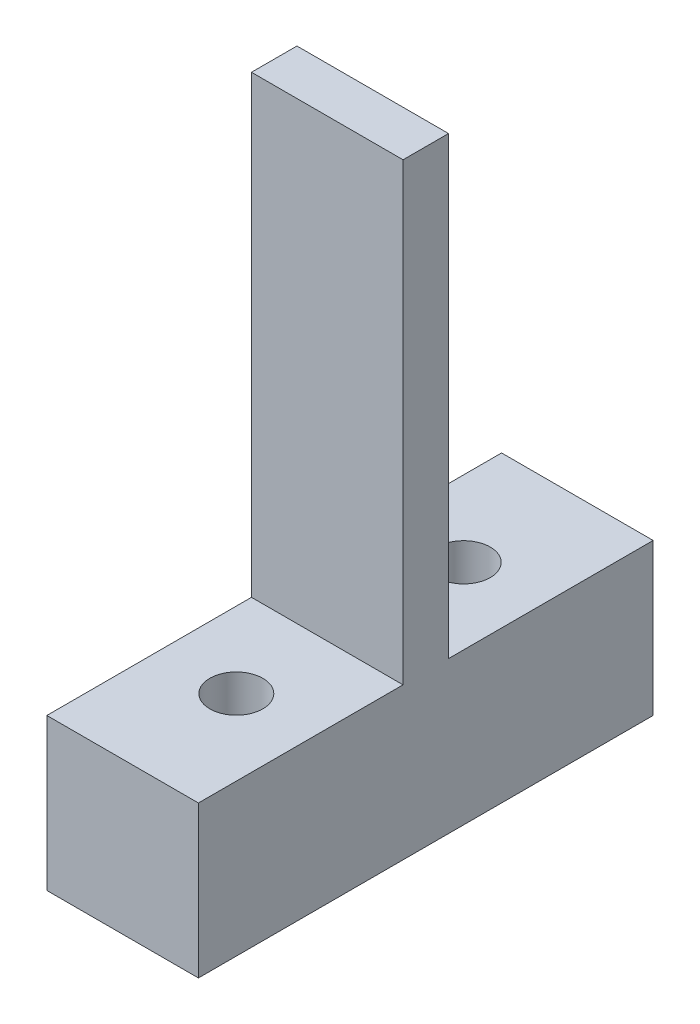
ISO-10303-21;
HEADER;
FILE_DESCRIPTION(('STEP AP214'),'2;1');
FILE_NAME('part.step','',(''),(''),'','','');
FILE_SCHEMA(('AUTOMOTIVE_DESIGN { 1 0 10303 214 1 1 1 1 }'));
ENDSEC;
DATA;
#1=APPLICATION_CONTEXT('core data for automotive mechanical design processes');
#2=APPLICATION_PROTOCOL_DEFINITION('international standard','automotive_design',2000,#1);
#3=PRODUCT_CONTEXT('',#1,'mechanical');
#4=PRODUCT('Part','Part','',(#3));
#5=PRODUCT_RELATED_PRODUCT_CATEGORY('part','',(#4));
#6=PRODUCT_DEFINITION_FORMATION('','',#4);
#7=PRODUCT_DEFINITION_CONTEXT('part definition',#1,'design');
#8=PRODUCT_DEFINITION('design','',#6,#7);
#9=PRODUCT_DEFINITION_SHAPE('','',#8);
#10=(LENGTH_UNIT() NAMED_UNIT(*) SI_UNIT(.MILLI.,.METRE.));
#11=(NAMED_UNIT(*) PLANE_ANGLE_UNIT() SI_UNIT($,.RADIAN.));
#12=(NAMED_UNIT(*) SI_UNIT($,.STERADIAN.) SOLID_ANGLE_UNIT());
#13=UNCERTAINTY_MEASURE_WITH_UNIT(LENGTH_MEASURE(1.E-05),#10,'distance_accuracy_value','');
#14=(GEOMETRIC_REPRESENTATION_CONTEXT(3) GLOBAL_UNCERTAINTY_ASSIGNED_CONTEXT((#13)) GLOBAL_UNIT_ASSIGNED_CONTEXT((#10,
#11,#12)) REPRESENTATION_CONTEXT('',''));
#15=CARTESIAN_POINT('',(0.,0.,0.));
#16=DIRECTION('',(0.,0.,1.));
#17=DIRECTION('',(1.,0.,0.));
#18=AXIS2_PLACEMENT_3D('',#15,#16,#17);
#19=CARTESIAN_POINT('',(0.,10.,0.));
#20=DIRECTION('',(0.,-1.,0.));
#21=DIRECTION('',(0.,0.,-1.));
#22=AXIS2_PLACEMENT_3D('',#19,#20,#21);
#23=PLANE('',#22);
#24=CARTESIAN_POINT('',(-41.8760329709807,10.,-13.3744966768709));
#25=DIRECTION('',(0.,1.,0.));
#26=DIRECTION('',(0.,0.,1.));
#27=AXIS2_PLACEMENT_3D('',#24,#25,#26);
#28=CIRCLE('',#27,1.75);
#29=CARTESIAN_POINT('',(-41.8760329709807,10.,-11.6244966768709));
#30=VERTEX_POINT('',#29);
#31=EDGE_CURVE('E125',#30,#30,#28,.T.);
#32=ORIENTED_EDGE('',*,*,#31,.F.);
#33=EDGE_LOOP('',(#32));
#34=FACE_BOUND('',#33,.T.);
#35=DIRECTION('',(-1.,0.,0.));
#36=VECTOR('',#35,1.);
#37=CARTESIAN_POINT('',(0.,10.,-7.37449667687092));
#38=LINE('',#37,#36);
#39=CARTESIAN_POINT('',(-36.8760329709807,10.,-7.37449667687092));
#40=VERTEX_POINT('',#39);
#41=CARTESIAN_POINT('',(-46.8760329709807,10.,-7.37449667687092));
#42=VERTEX_POINT('',#41);
#43=EDGE_CURVE('E49',#40,#42,#38,.T.);
#44=ORIENTED_EDGE('',*,*,#43,.F.);
#45=DIRECTION('',(0.,0.,-1.));
#46=VECTOR('',#45,1.);
#47=CARTESIAN_POINT('',(-36.8760329709807,10.,-20.8744966768709));
#48=LINE('',#47,#46);
#49=CARTESIAN_POINT('',(-36.8760329709807,10.,-20.8744966768709));
#50=VERTEX_POINT('',#49);
#51=EDGE_CURVE('E144',#40,#50,#48,.T.);
#52=ORIENTED_EDGE('',*,*,#51,.T.);
#53=DIRECTION('',(-1.,0.,0.));
#54=VECTOR('',#53,1.);
#55=CARTESIAN_POINT('',(-46.8760329709807,10.,-20.8744966768709));
#56=LINE('',#55,#54);
#57=CARTESIAN_POINT('',(-46.8760329709807,10.,-20.8744966768709));
#58=VERTEX_POINT('',#57);
#59=EDGE_CURVE('E147',#50,#58,#56,.T.);
#60=ORIENTED_EDGE('',*,*,#59,.T.);
#61=DIRECTION('',(0.,0.,1.));
#62=VECTOR('',#61,1.);
#63=CARTESIAN_POINT('',(-46.8760329709807,10.,9.12550332312908));
#64=LINE('',#63,#62);
#65=EDGE_CURVE('E140',#58,#42,#64,.T.);
#66=ORIENTED_EDGE('',*,*,#65,.T.);
#67=EDGE_LOOP('',(#44,#52,#60,#66));
#68=FACE_BOUND('',#67,.T.);
#69=ADVANCED_FACE('F34',(#34,#68),#23,.F.);
#70=CARTESIAN_POINT('',(-41.8760329709807,10.,1.62550332312908));
#71=DIRECTION('',(0.,1.,0.));
#72=DIRECTION('',(0.,0.,1.));
#73=AXIS2_PLACEMENT_3D('',#70,#71,#72);
#74=CIRCLE('',#73,1.75);
#75=CARTESIAN_POINT('',(-41.8760329709807,10.,3.37550332312908));
#76=VERTEX_POINT('',#75);
#77=EDGE_CURVE('E134',#76,#76,#74,.T.);
#78=ORIENTED_EDGE('',*,*,#77,.F.);
#79=EDGE_LOOP('',(#78));
#80=FACE_BOUND('',#79,.T.);
#81=DIRECTION('',(1.,0.,0.));
#82=VECTOR('',#81,1.);
#83=CARTESIAN_POINT('',(0.,10.,-4.37449667687092));
#84=LINE('',#83,#82);
#85=CARTESIAN_POINT('',(-46.8760329709807,10.,-4.37449667687092));
#86=VERTEX_POINT('',#85);
#87=CARTESIAN_POINT('',(-36.8760329709807,10.,-4.37449667687092));
#88=VERTEX_POINT('',#87);
#89=EDGE_CURVE('E57',#86,#88,#84,.T.);
#90=ORIENTED_EDGE('',*,*,#89,.F.);
#91=CARTESIAN_POINT('',(-46.8760329709807,10.,9.12550332312908));
#92=VERTEX_POINT('',#91);
#93=EDGE_CURVE('E121',#86,#92,#64,.T.);
#94=ORIENTED_EDGE('',*,*,#93,.T.);
#95=DIRECTION('',(1.,0.,0.));
#96=VECTOR('',#95,1.);
#97=CARTESIAN_POINT('',(-36.8760329709807,10.,9.12550332312908));
#98=LINE('',#97,#96);
#99=CARTESIAN_POINT('',(-36.8760329709807,10.,9.12550332312908));
#100=VERTEX_POINT('',#99);
#101=EDGE_CURVE('E142',#92,#100,#98,.T.);
#102=ORIENTED_EDGE('',*,*,#101,.T.);
#103=EDGE_CURVE('E145',#100,#88,#48,.T.);
#104=ORIENTED_EDGE('',*,*,#103,.T.);
#105=EDGE_LOOP('',(#90,#94,#102,#104));
#106=FACE_BOUND('',#105,.T.);
#107=ADVANCED_FACE('F200',(#80,#106),#23,.F.);
#108=CARTESIAN_POINT('',(0.,0.,0.));
#109=DIRECTION('',(0.,-1.,0.));
#110=DIRECTION('',(0.,0.,-1.));
#111=AXIS2_PLACEMENT_3D('',#108,#109,#110);
#112=PLANE('',#111);
#113=CARTESIAN_POINT('',(-41.8760329709807,0.,1.62550332312908));
#114=DIRECTION('',(0.,1.,0.));
#115=DIRECTION('',(0.,0.,1.));
#116=AXIS2_PLACEMENT_3D('',#113,#114,#115);
#117=CIRCLE('',#116,1.75);
#118=CARTESIAN_POINT('',(-41.8760329709807,0.,3.37550332312908));
#119=VERTEX_POINT('',#118);
#120=EDGE_CURVE('E132',#119,#119,#117,.T.);
#121=ORIENTED_EDGE('',*,*,#120,.T.);
#122=EDGE_LOOP('',(#121));
#123=FACE_BOUND('',#122,.T.);
#124=DIRECTION('',(0.,0.,1.));
#125=VECTOR('',#124,1.);
#126=CARTESIAN_POINT('',(-46.8760329709807,0.,9.12550332312908));
#127=LINE('',#126,#125);
#128=CARTESIAN_POINT('',(-46.8760329709807,0.,-20.8744966768709));
#129=VERTEX_POINT('',#128);
#130=CARTESIAN_POINT('',(-46.8760329709807,0.,9.12550332312908));
#131=VERTEX_POINT('',#130);
#132=EDGE_CURVE('E137',#129,#131,#127,.T.);
#133=ORIENTED_EDGE('',*,*,#132,.F.);
#134=DIRECTION('',(-1.,0.,0.));
#135=VECTOR('',#134,1.);
#136=CARTESIAN_POINT('',(-46.8760329709807,0.,-20.8744966768709));
#137=LINE('',#136,#135);
#138=CARTESIAN_POINT('',(-36.8760329709807,0.,-20.8744966768709));
#139=VERTEX_POINT('',#138);
#140=EDGE_CURVE('E155',#139,#129,#137,.T.);
#141=ORIENTED_EDGE('',*,*,#140,.F.);
#142=DIRECTION('',(0.,0.,-1.));
#143=VECTOR('',#142,1.);
#144=CARTESIAN_POINT('',(-36.8760329709807,0.,-20.8744966768709));
#145=LINE('',#144,#143);
#146=CARTESIAN_POINT('',(-36.8760329709807,0.,9.12550332312908));
#147=VERTEX_POINT('',#146);
#148=EDGE_CURVE('E153',#147,#139,#145,.T.);
#149=ORIENTED_EDGE('',*,*,#148,.F.);
#150=DIRECTION('',(1.,0.,0.));
#151=VECTOR('',#150,1.);
#152=CARTESIAN_POINT('',(-36.8760329709807,0.,9.12550332312908));
#153=LINE('',#152,#151);
#154=EDGE_CURVE('E151',#131,#147,#153,.T.);
#155=ORIENTED_EDGE('',*,*,#154,.F.);
#156=EDGE_LOOP('',(#133,#141,#149,#155));
#157=FACE_BOUND('',#156,.T.);
#158=CARTESIAN_POINT('',(-41.8760329709807,0.,-13.3744966768709));
#159=DIRECTION('',(0.,1.,0.));
#160=DIRECTION('',(0.,0.,1.));
#161=AXIS2_PLACEMENT_3D('',#158,#159,#160);
#162=CIRCLE('',#161,1.75);
#163=CARTESIAN_POINT('',(-41.8760329709807,0.,-11.6244966768709));
#164=VERTEX_POINT('',#163);
#165=EDGE_CURVE('E122',#164,#164,#162,.T.);
#166=ORIENTED_EDGE('',*,*,#165,.T.);
#167=EDGE_LOOP('',(#166));
#168=FACE_BOUND('',#167,.T.);
#169=ADVANCED_FACE('F173',(#123,#157,#168),#112,.T.);
#170=CARTESIAN_POINT('',(-46.8760329709807,10.,9.12550332312908));
#171=DIRECTION('',(1.,0.,0.));
#172=DIRECTION('',(0.,0.,-1.));
#173=AXIS2_PLACEMENT_3D('',#170,#171,#172);
#174=PLANE('',#173);
#175=ORIENTED_EDGE('',*,*,#132,.T.);
#176=DIRECTION('',(0.,-1.,0.));
#177=VECTOR('',#176,1.);
#178=CARTESIAN_POINT('',(-46.8760329709807,10.,9.12550332312908));
#179=LINE('',#178,#177);
#180=EDGE_CURVE('E11',#92,#131,#179,.T.);
#181=ORIENTED_EDGE('',*,*,#180,.F.);
#182=ORIENTED_EDGE('',*,*,#93,.F.);
#183=DIRECTION('',(0.,-1.,0.));
#184=VECTOR('',#183,1.);
#185=CARTESIAN_POINT('',(-46.8760329709807,40.,-4.37449667687092));
#186=LINE('',#185,#184);
#187=CARTESIAN_POINT('',(-46.8760329709807,40.,-4.37449667687092));
#188=VERTEX_POINT('',#187);
#189=EDGE_CURVE('E103',#188,#86,#186,.T.);
#190=ORIENTED_EDGE('',*,*,#189,.F.);
#191=DIRECTION('',(0.,0.,1.));
#192=VECTOR('',#191,1.);
#193=CARTESIAN_POINT('',(-46.8760329709807,40.,0.));
#194=LINE('',#193,#192);
#195=CARTESIAN_POINT('',(-46.8760329709807,40.,-7.37449667687092));
#196=VERTEX_POINT('',#195);
#197=EDGE_CURVE('E109',#196,#188,#194,.T.);
#198=ORIENTED_EDGE('',*,*,#197,.F.);
#199=DIRECTION('',(0.,-1.,0.));
#200=VECTOR('',#199,1.);
#201=CARTESIAN_POINT('',(-46.8760329709807,40.,-7.37449667687092));
#202=LINE('',#201,#200);
#203=EDGE_CURVE('E180',#196,#42,#202,.T.);
#204=ORIENTED_EDGE('',*,*,#203,.T.);
#205=ORIENTED_EDGE('',*,*,#65,.F.);
#206=DIRECTION('',(0.,-1.,0.));
#207=VECTOR('',#206,1.);
#208=CARTESIAN_POINT('',(-46.8760329709807,10.,-20.8744966768709));
#209=LINE('',#208,#207);
#210=EDGE_CURVE('E149',#58,#129,#209,.T.);
#211=ORIENTED_EDGE('',*,*,#210,.T.);
#212=EDGE_LOOP('',(#175,#181,#182,#190,#198,#204,#205,#211));
#213=FACE_BOUND('',#212,.T.);
#214=ADVANCED_FACE('F36',(#213),#174,.F.);
#215=CARTESIAN_POINT('',(-36.8760329709807,10.,9.12550332312908));
#216=DIRECTION('',(0.,0.,-1.));
#217=DIRECTION('',(-1.,0.,0.));
#218=AXIS2_PLACEMENT_3D('',#215,#216,#217);
#219=PLANE('',#218);
#220=ORIENTED_EDGE('',*,*,#154,.T.);
#221=DIRECTION('',(0.,-1.,0.));
#222=VECTOR('',#221,1.);
#223=CARTESIAN_POINT('',(-36.8760329709807,10.,9.12550332312908));
#224=LINE('',#223,#222);
#225=EDGE_CURVE('E42',#100,#147,#224,.T.);
#226=ORIENTED_EDGE('',*,*,#225,.F.);
#227=ORIENTED_EDGE('',*,*,#101,.F.);
#228=ORIENTED_EDGE('',*,*,#180,.T.);
#229=EDGE_LOOP('',(#220,#226,#227,#228));
#230=FACE_BOUND('',#229,.T.);
#231=ADVANCED_FACE('F218',(#230),#219,.F.);
#232=CARTESIAN_POINT('',(-36.8760329709807,10.,-20.8744966768709));
#233=DIRECTION('',(-1.,0.,0.));
#234=DIRECTION('',(0.,0.,1.));
#235=AXIS2_PLACEMENT_3D('',#232,#233,#234);
#236=PLANE('',#235);
#237=ORIENTED_EDGE('',*,*,#148,.T.);
#238=DIRECTION('',(0.,-1.,0.));
#239=VECTOR('',#238,1.);
#240=CARTESIAN_POINT('',(-36.8760329709807,10.,-20.8744966768709));
#241=LINE('',#240,#239);
#242=EDGE_CURVE('E159',#50,#139,#241,.T.);
#243=ORIENTED_EDGE('',*,*,#242,.F.);
#244=ORIENTED_EDGE('',*,*,#51,.F.);
#245=DIRECTION('',(0.,-1.,0.));
#246=VECTOR('',#245,1.);
#247=CARTESIAN_POINT('',(-36.8760329709807,40.,-7.37449667687092));
#248=LINE('',#247,#246);
#249=CARTESIAN_POINT('',(-36.8760329709807,40.,-7.37449667687092));
#250=VERTEX_POINT('',#249);
#251=EDGE_CURVE('E127',#250,#40,#248,.T.);
#252=ORIENTED_EDGE('',*,*,#251,.F.);
#253=DIRECTION('',(0.,0.,-1.));
#254=VECTOR('',#253,1.);
#255=CARTESIAN_POINT('',(-36.8760329709807,40.,0.));
#256=LINE('',#255,#254);
#257=CARTESIAN_POINT('',(-36.8760329709807,40.,-4.37449667687092));
#258=VERTEX_POINT('',#257);
#259=EDGE_CURVE('E108',#258,#250,#256,.T.);
#260=ORIENTED_EDGE('',*,*,#259,.F.);
#261=DIRECTION('',(0.,-1.,0.));
#262=VECTOR('',#261,1.);
#263=CARTESIAN_POINT('',(-36.8760329709807,40.,-4.37449667687092));
#264=LINE('',#263,#262);
#265=EDGE_CURVE('E105',#258,#88,#264,.T.);
#266=ORIENTED_EDGE('',*,*,#265,.T.);
#267=ORIENTED_EDGE('',*,*,#103,.F.);
#268=ORIENTED_EDGE('',*,*,#225,.T.);
#269=EDGE_LOOP('',(#237,#243,#244,#252,#260,#266,#267,#268));
#270=FACE_BOUND('',#269,.T.);
#271=ADVANCED_FACE('F166',(#270),#236,.F.);
#272=CARTESIAN_POINT('',(-46.8760329709807,10.,-20.8744966768709));
#273=DIRECTION('',(0.,0.,1.));
#274=DIRECTION('',(1.,0.,0.));
#275=AXIS2_PLACEMENT_3D('',#272,#273,#274);
#276=PLANE('',#275);
#277=ORIENTED_EDGE('',*,*,#140,.T.);
#278=ORIENTED_EDGE('',*,*,#210,.F.);
#279=ORIENTED_EDGE('',*,*,#59,.F.);
#280=ORIENTED_EDGE('',*,*,#242,.T.);
#281=EDGE_LOOP('',(#277,#278,#279,#280));
#282=FACE_BOUND('',#281,.T.);
#283=ADVANCED_FACE('F177',(#282),#276,.F.);
#284=CARTESIAN_POINT('',(-41.8760329709807,10.,1.62550332312908));
#285=DIRECTION('',(0.,-1.,0.));
#286=DIRECTION('',(0.,0.,-1.));
#287=AXIS2_PLACEMENT_3D('',#284,#285,#286);
#288=CYLINDRICAL_SURFACE('',#287,1.75);
#289=ORIENTED_EDGE('',*,*,#77,.T.);
#290=EDGE_LOOP('',(#289));
#291=FACE_BOUND('',#290,.T.);
#292=ORIENTED_EDGE('',*,*,#120,.F.);
#293=EDGE_LOOP('',(#292));
#294=FACE_BOUND('',#293,.T.);
#295=ADVANCED_FACE('F210',(#291,#294),#288,.F.);
#296=CARTESIAN_POINT('',(-41.8760329709807,10.,-13.3744966768709));
#297=DIRECTION('',(0.,-1.,0.));
#298=DIRECTION('',(0.,0.,-1.));
#299=AXIS2_PLACEMENT_3D('',#296,#297,#298);
#300=CYLINDRICAL_SURFACE('',#299,1.75);
#301=ORIENTED_EDGE('',*,*,#31,.T.);
#302=EDGE_LOOP('',(#301));
#303=FACE_BOUND('',#302,.T.);
#304=ORIENTED_EDGE('',*,*,#165,.F.);
#305=EDGE_LOOP('',(#304));
#306=FACE_BOUND('',#305,.T.);
#307=ADVANCED_FACE('F197',(#303,#306),#300,.F.);
#308=CARTESIAN_POINT('',(0.,40.,-4.37449667687092));
#309=DIRECTION('',(0.,0.,-1.));
#310=DIRECTION('',(-1.,0.,0.));
#311=AXIS2_PLACEMENT_3D('',#308,#309,#310);
#312=PLANE('',#311);
#313=ORIENTED_EDGE('',*,*,#89,.T.);
#314=ORIENTED_EDGE('',*,*,#265,.F.);
#315=DIRECTION('',(1.,0.,0.));
#316=VECTOR('',#315,1.);
#317=CARTESIAN_POINT('',(0.,40.,-4.37449667687092));
#318=LINE('',#317,#316);
#319=EDGE_CURVE('E99',#188,#258,#318,.T.);
#320=ORIENTED_EDGE('',*,*,#319,.F.);
#321=ORIENTED_EDGE('',*,*,#189,.T.);
#322=EDGE_LOOP('',(#313,#314,#320,#321));
#323=FACE_BOUND('',#322,.T.);
#324=ADVANCED_FACE('F101',(#323),#312,.F.);
#325=CARTESIAN_POINT('',(0.,40.,-7.37449667687092));
#326=DIRECTION('',(0.,0.,1.));
#327=DIRECTION('',(1.,0.,0.));
#328=AXIS2_PLACEMENT_3D('',#325,#326,#327);
#329=PLANE('',#328);
#330=ORIENTED_EDGE('',*,*,#43,.T.);
#331=ORIENTED_EDGE('',*,*,#203,.F.);
#332=DIRECTION('',(-1.,0.,0.));
#333=VECTOR('',#332,1.);
#334=CARTESIAN_POINT('',(0.,40.,-7.37449667687092));
#335=LINE('',#334,#333);
#336=EDGE_CURVE('E114',#250,#196,#335,.T.);
#337=ORIENTED_EDGE('',*,*,#336,.F.);
#338=ORIENTED_EDGE('',*,*,#251,.T.);
#339=EDGE_LOOP('',(#330,#331,#337,#338));
#340=FACE_BOUND('',#339,.T.);
#341=ADVANCED_FACE('F183',(#340),#329,.F.);
#342=CARTESIAN_POINT('',(0.,40.,0.));
#343=DIRECTION('',(0.,1.,0.));
#344=DIRECTION('',(0.,0.,1.));
#345=AXIS2_PLACEMENT_3D('',#342,#343,#344);
#346=PLANE('',#345);
#347=ORIENTED_EDGE('',*,*,#197,.T.);
#348=ORIENTED_EDGE('',*,*,#319,.T.);
#349=ORIENTED_EDGE('',*,*,#259,.T.);
#350=ORIENTED_EDGE('',*,*,#336,.T.);
#351=EDGE_LOOP('',(#347,#348,#349,#350));
#352=FACE_BOUND('',#351,.T.);
#353=ADVANCED_FACE('F112',(#352),#346,.T.);
#354=CLOSED_SHELL('',(#69,#107,#169,#214,#231,#271,#283,#295,#307,#324,#341,#353));
#355=MANIFOLD_SOLID_BREP('B2',#354);
#356=ADVANCED_BREP_SHAPE_REPRESENTATION('',(#18,#355),#14);
#357=SHAPE_DEFINITION_REPRESENTATION(#9,#356);
ENDSEC;
END-ISO-10303-21;
